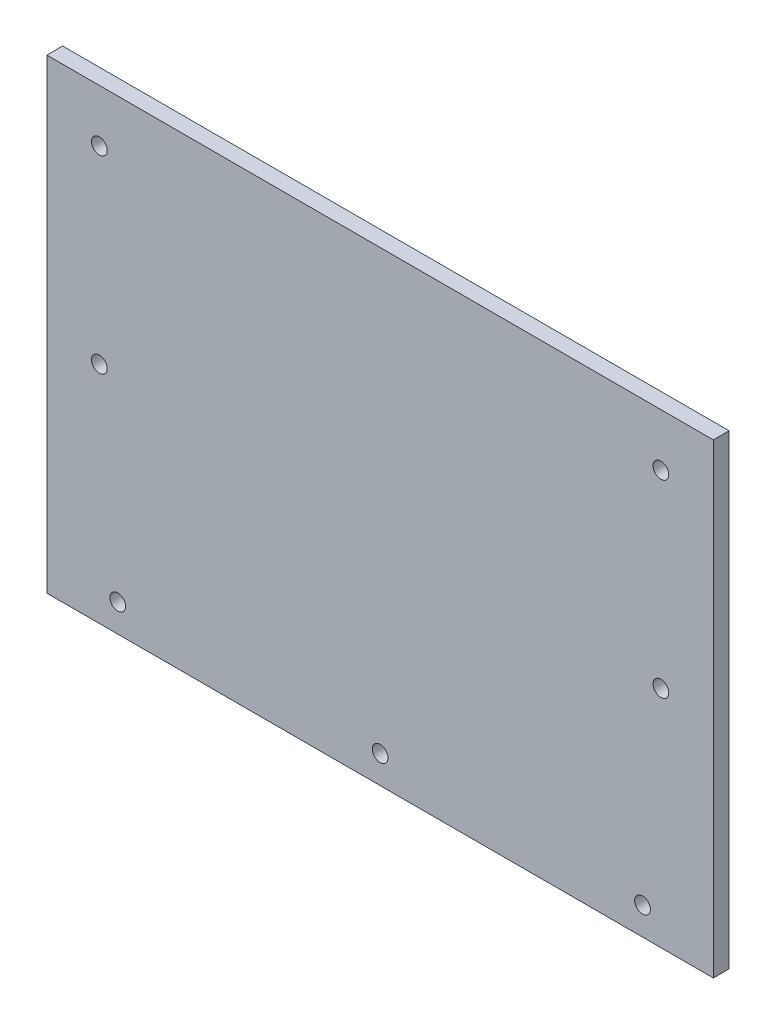
ISO-10303-21;
HEADER;
FILE_DESCRIPTION(('STEP AP214'),'2;1');
FILE_NAME('part.step','',(''),(''),'','','');
FILE_SCHEMA(('AUTOMOTIVE_DESIGN { 1 0 10303 214 1 1 1 1 }'));
ENDSEC;
DATA;
#1=APPLICATION_CONTEXT('core data for automotive mechanical design processes');
#2=APPLICATION_PROTOCOL_DEFINITION('international standard','automotive_design',2000,#1);
#3=PRODUCT_CONTEXT('',#1,'mechanical');
#4=PRODUCT('Part','Part','',(#3));
#5=PRODUCT_RELATED_PRODUCT_CATEGORY('part','',(#4));
#6=PRODUCT_DEFINITION_FORMATION('','',#4);
#7=PRODUCT_DEFINITION_CONTEXT('part definition',#1,'design');
#8=PRODUCT_DEFINITION('design','',#6,#7);
#9=PRODUCT_DEFINITION_SHAPE('','',#8);
#10=(LENGTH_UNIT() NAMED_UNIT(*) SI_UNIT(.MILLI.,.METRE.));
#11=(NAMED_UNIT(*) PLANE_ANGLE_UNIT() SI_UNIT($,.RADIAN.));
#12=(NAMED_UNIT(*) SI_UNIT($,.STERADIAN.) SOLID_ANGLE_UNIT());
#13=UNCERTAINTY_MEASURE_WITH_UNIT(LENGTH_MEASURE(1.E-05),#10,'distance_accuracy_value','');
#14=(GEOMETRIC_REPRESENTATION_CONTEXT(3) GLOBAL_UNCERTAINTY_ASSIGNED_CONTEXT((#13)) GLOBAL_UNIT_ASSIGNED_CONTEXT((#10,
#11,#12)) REPRESENTATION_CONTEXT('',''));
#15=CARTESIAN_POINT('',(0.,0.,0.));
#16=DIRECTION('',(0.,0.,1.));
#17=DIRECTION('',(1.,0.,0.));
#18=AXIS2_PLACEMENT_3D('',#15,#16,#17);
#19=CARTESIAN_POINT('',(0.,0.,3.));
#20=DIRECTION('',(0.,0.,1.));
#21=DIRECTION('',(1.,0.,0.));
#22=AXIS2_PLACEMENT_3D('',#19,#20,#21);
#23=PLANE('',#22);
#24=DIRECTION('',(-1.,0.,0.));
#25=VECTOR('',#24,1.);
#26=CARTESIAN_POINT('',(0.,-42.8,3.));
#27=LINE('',#26,#25);
#28=CARTESIAN_POINT('',(63.5,-42.8,3.));
#29=VERTEX_POINT('',#28);
#30=CARTESIAN_POINT('',(-63.5,-42.8,3.));
#31=VERTEX_POINT('',#30);
#32=EDGE_CURVE('E170',#29,#31,#27,.T.);
#33=ORIENTED_EDGE('',*,*,#32,.F.);
#34=DIRECTION('',(0.,1.,0.));
#35=VECTOR('',#34,1.);
#36=CARTESIAN_POINT('',(63.5,-46.,3.));
#37=LINE('',#36,#35);
#38=CARTESIAN_POINT('',(63.5,46.,3.));
#39=VERTEX_POINT('',#38);
#40=EDGE_CURVE('E116',#29,#39,#37,.T.);
#41=ORIENTED_EDGE('',*,*,#40,.T.);
#42=DIRECTION('',(-1.,0.,0.));
#43=VECTOR('',#42,1.);
#44=CARTESIAN_POINT('',(63.5,46.,3.));
#45=LINE('',#44,#43);
#46=CARTESIAN_POINT('',(-63.5,46.,3.));
#47=VERTEX_POINT('',#46);
#48=EDGE_CURVE('E67',#39,#47,#45,.T.);
#49=ORIENTED_EDGE('',*,*,#48,.T.);
#50=DIRECTION('',(0.,-1.,0.));
#51=VECTOR('',#50,1.);
#52=CARTESIAN_POINT('',(-63.5,-46.,3.));
#53=LINE('',#52,#51);
#54=EDGE_CURVE('E90',#47,#31,#53,.T.);
#55=ORIENTED_EDGE('',*,*,#54,.T.);
#56=EDGE_LOOP('',(#33,#41,#49,#55));
#57=FACE_BOUND('',#56,.T.);
#58=CARTESIAN_POINT('',(53.5,0.,3.));
#59=DIRECTION('',(0.,0.,1.));
#60=DIRECTION('',(1.,0.,0.));
#61=AXIS2_PLACEMENT_3D('',#58,#59,#60);
#62=CIRCLE('',#61,1.5);
#63=CARTESIAN_POINT('',(55.,0.,3.));
#64=VERTEX_POINT('',#63);
#65=EDGE_CURVE('E166',#64,#64,#62,.F.);
#66=ORIENTED_EDGE('',*,*,#65,.T.);
#67=EDGE_LOOP('',(#66));
#68=FACE_BOUND('',#67,.T.);
#69=CARTESIAN_POINT('',(-53.5,36.,3.));
#70=DIRECTION('',(0.,0.,1.));
#71=DIRECTION('',(1.,0.,0.));
#72=AXIS2_PLACEMENT_3D('',#69,#70,#71);
#73=CIRCLE('',#72,1.5);
#74=CARTESIAN_POINT('',(-52.,36.,3.));
#75=VERTEX_POINT('',#74);
#76=EDGE_CURVE('E142',#75,#75,#73,.T.);
#77=ORIENTED_EDGE('',*,*,#76,.F.);
#78=EDGE_LOOP('',(#77));
#79=FACE_BOUND('',#78,.T.);
#80=CARTESIAN_POINT('',(-50.,-37.5,3.));
#81=DIRECTION('',(0.,0.,1.));
#82=DIRECTION('',(1.,0.,0.));
#83=AXIS2_PLACEMENT_3D('',#80,#81,#82);
#84=CIRCLE('',#83,1.5);
#85=CARTESIAN_POINT('',(-48.5,-37.5,3.));
#86=VERTEX_POINT('',#85);
#87=EDGE_CURVE('E109',#86,#86,#84,.T.);
#88=ORIENTED_EDGE('',*,*,#87,.F.);
#89=EDGE_LOOP('',(#88));
#90=FACE_BOUND('',#89,.T.);
#91=CARTESIAN_POINT('',(0.,-37.5,3.));
#92=DIRECTION('',(0.,0.,1.));
#93=DIRECTION('',(1.,0.,0.));
#94=AXIS2_PLACEMENT_3D('',#91,#92,#93);
#95=CIRCLE('',#94,1.5);
#96=CARTESIAN_POINT('',(1.5,-37.5,3.));
#97=VERTEX_POINT('',#96);
#98=EDGE_CURVE('E131',#97,#97,#95,.T.);
#99=ORIENTED_EDGE('',*,*,#98,.F.);
#100=EDGE_LOOP('',(#99));
#101=FACE_BOUND('',#100,.T.);
#102=CARTESIAN_POINT('',(50.,-37.5,3.));
#103=DIRECTION('',(0.,0.,1.));
#104=DIRECTION('',(1.,0.,0.));
#105=AXIS2_PLACEMENT_3D('',#102,#103,#104);
#106=CIRCLE('',#105,1.5);
#107=CARTESIAN_POINT('',(51.5,-37.5,3.));
#108=VERTEX_POINT('',#107);
#109=EDGE_CURVE('E122',#108,#108,#106,.T.);
#110=ORIENTED_EDGE('',*,*,#109,.F.);
#111=EDGE_LOOP('',(#110));
#112=FACE_BOUND('',#111,.T.);
#113=CARTESIAN_POINT('',(-53.5,0.,3.));
#114=DIRECTION('',(0.,0.,1.));
#115=DIRECTION('',(1.,0.,0.));
#116=AXIS2_PLACEMENT_3D('',#113,#114,#115);
#117=CIRCLE('',#116,1.5);
#118=CARTESIAN_POINT('',(-52.,0.,3.));
#119=VERTEX_POINT('',#118);
#120=EDGE_CURVE('E150',#119,#119,#117,.T.);
#121=ORIENTED_EDGE('',*,*,#120,.F.);
#122=EDGE_LOOP('',(#121));
#123=FACE_BOUND('',#122,.T.);
#124=CARTESIAN_POINT('',(53.5,36.,3.));
#125=DIRECTION('',(0.,0.,1.));
#126=DIRECTION('',(1.,0.,0.));
#127=AXIS2_PLACEMENT_3D('',#124,#125,#126);
#128=CIRCLE('',#127,1.5);
#129=CARTESIAN_POINT('',(55.,36.,3.));
#130=VERTEX_POINT('',#129);
#131=EDGE_CURVE('E159',#130,#130,#128,.F.);
#132=ORIENTED_EDGE('',*,*,#131,.T.);
#133=EDGE_LOOP('',(#132));
#134=FACE_BOUND('',#133,.T.);
#135=ADVANCED_FACE('F43',(#57,#68,#79,#90,#101,#112,#123,#134),#23,.T.);
#136=CARTESIAN_POINT('',(0.,0.,0.));
#137=DIRECTION('',(0.,0.,1.));
#138=DIRECTION('',(1.,0.,0.));
#139=AXIS2_PLACEMENT_3D('',#136,#137,#138);
#140=PLANE('',#139);
#141=CARTESIAN_POINT('',(-53.5,0.,0.));
#142=DIRECTION('',(0.,0.,1.));
#143=DIRECTION('',(1.,0.,0.));
#144=AXIS2_PLACEMENT_3D('',#141,#142,#143);
#145=CIRCLE('',#144,1.5);
#146=CARTESIAN_POINT('',(-52.,0.,0.));
#147=VERTEX_POINT('',#146);
#148=EDGE_CURVE('E154',#147,#147,#145,.T.);
#149=ORIENTED_EDGE('',*,*,#148,.T.);
#150=EDGE_LOOP('',(#149));
#151=FACE_BOUND('',#150,.T.);
#152=CARTESIAN_POINT('',(-53.5,36.,0.));
#153=DIRECTION('',(0.,0.,1.));
#154=DIRECTION('',(1.,0.,0.));
#155=AXIS2_PLACEMENT_3D('',#152,#153,#154);
#156=CIRCLE('',#155,1.5);
#157=CARTESIAN_POINT('',(-52.,36.,0.));
#158=VERTEX_POINT('',#157);
#159=EDGE_CURVE('E127',#158,#158,#156,.T.);
#160=ORIENTED_EDGE('',*,*,#159,.T.);
#161=EDGE_LOOP('',(#160));
#162=FACE_BOUND('',#161,.T.);
#163=CARTESIAN_POINT('',(-50.,-37.5,0.));
#164=DIRECTION('',(0.,0.,1.));
#165=DIRECTION('',(1.,0.,0.));
#166=AXIS2_PLACEMENT_3D('',#163,#164,#165);
#167=CIRCLE('',#166,1.5);
#168=CARTESIAN_POINT('',(-48.5,-37.5,0.));
#169=VERTEX_POINT('',#168);
#170=EDGE_CURVE('E103',#169,#169,#167,.T.);
#171=ORIENTED_EDGE('',*,*,#170,.T.);
#172=EDGE_LOOP('',(#171));
#173=FACE_BOUND('',#172,.T.);
#174=CARTESIAN_POINT('',(0.,-37.5,0.));
#175=DIRECTION('',(0.,0.,1.));
#176=DIRECTION('',(1.,0.,0.));
#177=AXIS2_PLACEMENT_3D('',#174,#175,#176);
#178=CIRCLE('',#177,1.5);
#179=CARTESIAN_POINT('',(1.5,-37.5,0.));
#180=VERTEX_POINT('',#179);
#181=EDGE_CURVE('E135',#180,#180,#178,.T.);
#182=ORIENTED_EDGE('',*,*,#181,.T.);
#183=EDGE_LOOP('',(#182));
#184=FACE_BOUND('',#183,.T.);
#185=CARTESIAN_POINT('',(50.,-37.5,0.));
#186=DIRECTION('',(0.,0.,1.));
#187=DIRECTION('',(1.,0.,0.));
#188=AXIS2_PLACEMENT_3D('',#185,#186,#187);
#189=CIRCLE('',#188,1.5);
#190=CARTESIAN_POINT('',(51.5,-37.5,0.));
#191=VERTEX_POINT('',#190);
#192=EDGE_CURVE('E126',#191,#191,#189,.T.);
#193=ORIENTED_EDGE('',*,*,#192,.T.);
#194=EDGE_LOOP('',(#193));
#195=FACE_BOUND('',#194,.T.);
#196=DIRECTION('',(0.,1.,0.));
#197=VECTOR('',#196,1.);
#198=CARTESIAN_POINT('',(63.5,-46.,0.));
#199=LINE('',#198,#197);
#200=CARTESIAN_POINT('',(63.5,-42.8,0.));
#201=VERTEX_POINT('',#200);
#202=CARTESIAN_POINT('',(63.5,46.,0.));
#203=VERTEX_POINT('',#202);
#204=EDGE_CURVE('E91',#201,#203,#199,.T.);
#205=ORIENTED_EDGE('',*,*,#204,.F.);
#206=DIRECTION('',(1.,0.,0.));
#207=VECTOR('',#206,1.);
#208=CARTESIAN_POINT('',(63.5,-42.8,0.));
#209=LINE('',#208,#207);
#210=CARTESIAN_POINT('',(-63.5,-42.8,0.));
#211=VERTEX_POINT('',#210);
#212=EDGE_CURVE('E59',#211,#201,#209,.T.);
#213=ORIENTED_EDGE('',*,*,#212,.F.);
#214=DIRECTION('',(0.,-1.,0.));
#215=VECTOR('',#214,1.);
#216=CARTESIAN_POINT('',(-63.5,-46.,0.));
#217=LINE('',#216,#215);
#218=CARTESIAN_POINT('',(-63.5,46.,0.));
#219=VERTEX_POINT('',#218);
#220=EDGE_CURVE('E97',#219,#211,#217,.T.);
#221=ORIENTED_EDGE('',*,*,#220,.F.);
#222=DIRECTION('',(-1.,0.,0.));
#223=VECTOR('',#222,1.);
#224=CARTESIAN_POINT('',(63.5,46.,0.));
#225=LINE('',#224,#223);
#226=EDGE_CURVE('E80',#203,#219,#225,.T.);
#227=ORIENTED_EDGE('',*,*,#226,.F.);
#228=EDGE_LOOP('',(#205,#213,#221,#227));
#229=FACE_BOUND('',#228,.T.);
#230=CARTESIAN_POINT('',(53.5,0.,0.));
#231=DIRECTION('',(0.,0.,1.));
#232=DIRECTION('',(1.,0.,0.));
#233=AXIS2_PLACEMENT_3D('',#230,#231,#232);
#234=CIRCLE('',#233,1.5);
#235=CARTESIAN_POINT('',(55.,0.,0.));
#236=VERTEX_POINT('',#235);
#237=EDGE_CURVE('E155',#236,#236,#234,.F.);
#238=ORIENTED_EDGE('',*,*,#237,.F.);
#239=EDGE_LOOP('',(#238));
#240=FACE_BOUND('',#239,.T.);
#241=CARTESIAN_POINT('',(53.5,36.,0.));
#242=DIRECTION('',(0.,0.,1.));
#243=DIRECTION('',(1.,0.,0.));
#244=AXIS2_PLACEMENT_3D('',#241,#242,#243);
#245=CIRCLE('',#244,1.5);
#246=CARTESIAN_POINT('',(55.,36.,0.));
#247=VERTEX_POINT('',#246);
#248=EDGE_CURVE('E146',#247,#247,#245,.F.);
#249=ORIENTED_EDGE('',*,*,#248,.F.);
#250=EDGE_LOOP('',(#249));
#251=FACE_BOUND('',#250,.T.);
#252=ADVANCED_FACE('F100',(#151,#162,#173,#184,#195,#229,#240,#251),#140,.F.);
#253=CARTESIAN_POINT('',(-63.5,-46.,3.));
#254=DIRECTION('',(1.,0.,0.));
#255=DIRECTION('',(0.,0.,-1.));
#256=AXIS2_PLACEMENT_3D('',#253,#254,#255);
#257=PLANE('',#256);
#258=ORIENTED_EDGE('',*,*,#220,.T.);
#259=DIRECTION('',(0.,0.,-1.));
#260=VECTOR('',#259,1.);
#261=CARTESIAN_POINT('',(-63.5,-42.8,10.));
#262=LINE('',#261,#260);
#263=EDGE_CURVE('E177',#31,#211,#262,.T.);
#264=ORIENTED_EDGE('',*,*,#263,.F.);
#265=ORIENTED_EDGE('',*,*,#54,.F.);
#266=DIRECTION('',(0.,0.,-1.));
#267=VECTOR('',#266,1.);
#268=CARTESIAN_POINT('',(-63.5,46.,3.));
#269=LINE('',#268,#267);
#270=EDGE_CURVE('E83',#47,#219,#269,.T.);
#271=ORIENTED_EDGE('',*,*,#270,.T.);
#272=EDGE_LOOP('',(#258,#264,#265,#271));
#273=FACE_BOUND('',#272,.T.);
#274=ADVANCED_FACE('F45',(#273),#257,.F.);
#275=CARTESIAN_POINT('',(63.5,-46.,3.));
#276=DIRECTION('',(-1.,0.,0.));
#277=DIRECTION('',(0.,0.,1.));
#278=AXIS2_PLACEMENT_3D('',#275,#276,#277);
#279=PLANE('',#278);
#280=ORIENTED_EDGE('',*,*,#40,.F.);
#281=DIRECTION('',(0.,0.,-1.));
#282=VECTOR('',#281,1.);
#283=CARTESIAN_POINT('',(63.5,-42.8,3.));
#284=LINE('',#283,#282);
#285=EDGE_CURVE('E11',#29,#201,#284,.T.);
#286=ORIENTED_EDGE('',*,*,#285,.T.);
#287=ORIENTED_EDGE('',*,*,#204,.T.);
#288=DIRECTION('',(0.,0.,-1.));
#289=VECTOR('',#288,1.);
#290=CARTESIAN_POINT('',(63.5,46.,3.));
#291=LINE('',#290,#289);
#292=EDGE_CURVE('E52',#39,#203,#291,.T.);
#293=ORIENTED_EDGE('',*,*,#292,.F.);
#294=EDGE_LOOP('',(#280,#286,#287,#293));
#295=FACE_BOUND('',#294,.T.);
#296=ADVANCED_FACE('F187',(#295),#279,.F.);
#297=CARTESIAN_POINT('',(63.5,46.,3.));
#298=DIRECTION('',(0.,-1.,0.));
#299=DIRECTION('',(1.,0.,0.));
#300=AXIS2_PLACEMENT_3D('',#297,#298,#299);
#301=PLANE('',#300);
#302=ORIENTED_EDGE('',*,*,#226,.T.);
#303=ORIENTED_EDGE('',*,*,#270,.F.);
#304=ORIENTED_EDGE('',*,*,#48,.F.);
#305=ORIENTED_EDGE('',*,*,#292,.T.);
#306=EDGE_LOOP('',(#302,#303,#304,#305));
#307=FACE_BOUND('',#306,.T.);
#308=ADVANCED_FACE('F82',(#307),#301,.F.);
#309=CARTESIAN_POINT('',(50.,-37.5,0.));
#310=DIRECTION('',(0.,0.,1.));
#311=DIRECTION('',(1.,0.,0.));
#312=AXIS2_PLACEMENT_3D('',#309,#310,#311);
#313=CYLINDRICAL_SURFACE('',#312,1.5);
#314=ORIENTED_EDGE('',*,*,#192,.F.);
#315=EDGE_LOOP('',(#314));
#316=FACE_BOUND('',#315,.T.);
#317=ORIENTED_EDGE('',*,*,#109,.T.);
#318=EDGE_LOOP('',(#317));
#319=FACE_BOUND('',#318,.T.);
#320=ADVANCED_FACE('F193',(#316,#319),#313,.F.);
#321=CARTESIAN_POINT('',(0.,-37.5,0.));
#322=DIRECTION('',(0.,0.,1.));
#323=DIRECTION('',(1.,0.,0.));
#324=AXIS2_PLACEMENT_3D('',#321,#322,#323);
#325=CYLINDRICAL_SURFACE('',#324,1.5);
#326=ORIENTED_EDGE('',*,*,#181,.F.);
#327=EDGE_LOOP('',(#326));
#328=FACE_BOUND('',#327,.T.);
#329=ORIENTED_EDGE('',*,*,#98,.T.);
#330=EDGE_LOOP('',(#329));
#331=FACE_BOUND('',#330,.T.);
#332=ADVANCED_FACE('F205',(#328,#331),#325,.F.);
#333=CARTESIAN_POINT('',(-50.,-37.5,0.));
#334=DIRECTION('',(0.,0.,1.));
#335=DIRECTION('',(1.,0.,0.));
#336=AXIS2_PLACEMENT_3D('',#333,#334,#335);
#337=CYLINDRICAL_SURFACE('',#336,1.5);
#338=ORIENTED_EDGE('',*,*,#170,.F.);
#339=EDGE_LOOP('',(#338));
#340=FACE_BOUND('',#339,.T.);
#341=ORIENTED_EDGE('',*,*,#87,.T.);
#342=EDGE_LOOP('',(#341));
#343=FACE_BOUND('',#342,.T.);
#344=ADVANCED_FACE('F209',(#340,#343),#337,.F.);
#345=CARTESIAN_POINT('',(-53.5,36.,0.));
#346=DIRECTION('',(0.,0.,1.));
#347=DIRECTION('',(1.,0.,0.));
#348=AXIS2_PLACEMENT_3D('',#345,#346,#347);
#349=CYLINDRICAL_SURFACE('',#348,1.5);
#350=ORIENTED_EDGE('',*,*,#159,.F.);
#351=EDGE_LOOP('',(#350));
#352=FACE_BOUND('',#351,.T.);
#353=ORIENTED_EDGE('',*,*,#76,.T.);
#354=EDGE_LOOP('',(#353));
#355=FACE_BOUND('',#354,.T.);
#356=ADVANCED_FACE('F213',(#352,#355),#349,.F.);
#357=CARTESIAN_POINT('',(53.5,0.,0.));
#358=DIRECTION('',(0.,0.,1.));
#359=DIRECTION('',(1.,0.,0.));
#360=AXIS2_PLACEMENT_3D('',#357,#358,#359);
#361=CYLINDRICAL_SURFACE('',#360,1.5);
#362=ORIENTED_EDGE('',*,*,#237,.T.);
#363=EDGE_LOOP('',(#362));
#364=FACE_BOUND('',#363,.T.);
#365=ORIENTED_EDGE('',*,*,#65,.F.);
#366=EDGE_LOOP('',(#365));
#367=FACE_BOUND('',#366,.T.);
#368=ADVANCED_FACE('F217',(#364,#367),#361,.F.);
#369=CARTESIAN_POINT('',(-53.5,0.,0.));
#370=DIRECTION('',(0.,0.,1.));
#371=DIRECTION('',(1.,0.,0.));
#372=AXIS2_PLACEMENT_3D('',#369,#370,#371);
#373=CYLINDRICAL_SURFACE('',#372,1.5);
#374=ORIENTED_EDGE('',*,*,#148,.F.);
#375=EDGE_LOOP('',(#374));
#376=FACE_BOUND('',#375,.T.);
#377=ORIENTED_EDGE('',*,*,#120,.T.);
#378=EDGE_LOOP('',(#377));
#379=FACE_BOUND('',#378,.T.);
#380=ADVANCED_FACE('F219',(#376,#379),#373,.F.);
#381=CARTESIAN_POINT('',(53.5,36.,0.));
#382=DIRECTION('',(0.,0.,1.));
#383=DIRECTION('',(1.,0.,0.));
#384=AXIS2_PLACEMENT_3D('',#381,#382,#383);
#385=CYLINDRICAL_SURFACE('',#384,1.5);
#386=ORIENTED_EDGE('',*,*,#248,.T.);
#387=EDGE_LOOP('',(#386));
#388=FACE_BOUND('',#387,.T.);
#389=ORIENTED_EDGE('',*,*,#131,.F.);
#390=EDGE_LOOP('',(#389));
#391=FACE_BOUND('',#390,.T.);
#392=ADVANCED_FACE('F222',(#388,#391),#385,.F.);
#393=CARTESIAN_POINT('',(63.5,-42.8,10.));
#394=DIRECTION('',(0.,1.,0.));
#395=DIRECTION('',(0.,0.,1.));
#396=AXIS2_PLACEMENT_3D('',#393,#394,#395);
#397=PLANE('',#396);
#398=ORIENTED_EDGE('',*,*,#32,.T.);
#399=ORIENTED_EDGE('',*,*,#263,.T.);
#400=ORIENTED_EDGE('',*,*,#212,.T.);
#401=ORIENTED_EDGE('',*,*,#285,.F.);
#402=EDGE_LOOP('',(#398,#399,#400,#401));
#403=FACE_BOUND('',#402,.T.);
#404=ADVANCED_FACE('F181',(#403),#397,.F.);
#405=CLOSED_SHELL('',(#135,#252,#274,#296,#308,#320,#332,#344,#356,#368,#380,#392,#404));
#406=MANIFOLD_SOLID_BREP('B2',#405);
#407=ADVANCED_BREP_SHAPE_REPRESENTATION('',(#18,#406),#14);
#408=SHAPE_DEFINITION_REPRESENTATION(#9,#407);
ENDSEC;
END-ISO-10303-21;
